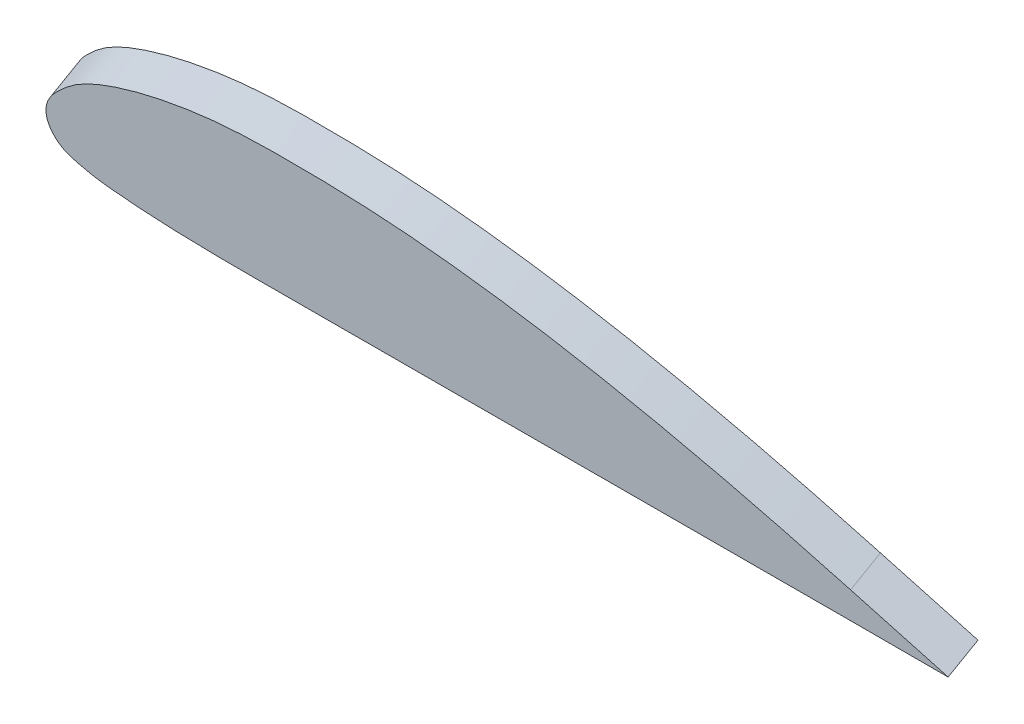
ISO-10303-21;
HEADER;
FILE_DESCRIPTION(('STEP AP214'),'2;1');
FILE_NAME('part.step','',(''),(''),'','','');
FILE_SCHEMA(('AUTOMOTIVE_DESIGN { 1 0 10303 214 1 1 1 1 }'));
ENDSEC;
DATA;
#1=APPLICATION_CONTEXT('core data for automotive mechanical design processes');
#2=APPLICATION_PROTOCOL_DEFINITION('international standard','automotive_design',2000,#1);
#3=PRODUCT_CONTEXT('',#1,'mechanical');
#4=PRODUCT('Part','Part','',(#3));
#5=PRODUCT_RELATED_PRODUCT_CATEGORY('part','',(#4));
#6=PRODUCT_DEFINITION_FORMATION('','',#4);
#7=PRODUCT_DEFINITION_CONTEXT('part definition',#1,'design');
#8=PRODUCT_DEFINITION('design','',#6,#7);
#9=PRODUCT_DEFINITION_SHAPE('','',#8);
#10=(LENGTH_UNIT() NAMED_UNIT(*) SI_UNIT(.MILLI.,.METRE.));
#11=(NAMED_UNIT(*) PLANE_ANGLE_UNIT() SI_UNIT($,.RADIAN.));
#12=(NAMED_UNIT(*) SI_UNIT($,.STERADIAN.) SOLID_ANGLE_UNIT());
#13=UNCERTAINTY_MEASURE_WITH_UNIT(LENGTH_MEASURE(1.E-05),#10,'distance_accuracy_value','');
#14=(GEOMETRIC_REPRESENTATION_CONTEXT(3) GLOBAL_UNCERTAINTY_ASSIGNED_CONTEXT((#13)) GLOBAL_UNIT_ASSIGNED_CONTEXT((#10,
#11,#12)) REPRESENTATION_CONTEXT('',''));
#15=CARTESIAN_POINT('',(0.,0.,0.));
#16=DIRECTION('',(0.,0.,1.));
#17=DIRECTION('',(1.,0.,0.));
#18=AXIS2_PLACEMENT_3D('',#15,#16,#17);
#19=CARTESIAN_POINT('',(354.90964458785,29.1294869729212,0.));
#20=DIRECTION('',(0.,0.,-1.));
#21=DIRECTION('',(-1.,0.,0.));
#22=AXIS2_PLACEMENT_3D('',#19,#20,#21);
#23=PLANE('',#22);
#24=CARTESIAN_POINT('',(439.94359402656,25.9631496413614,0.));
#25=CARTESIAN_POINT('',(436.482792760671,26.9124708064895,0.));
#26=CARTESIAN_POINT('',(429.550066215445,28.7613489740832,0.));
#27=CARTESIAN_POINT('',(419.041111506581,31.1758554931935,0.));
#28=CARTESIAN_POINT('',(408.453689189646,33.2394395205814,0.));
#29=CARTESIAN_POINT('',(399.52973881786,34.5106097507142,0.));
#30=CARTESIAN_POINT('',(392.35118296949,35.2135057166244,0.));
#31=CARTESIAN_POINT('',(386.932530948564,35.5372889132557,0.));
#32=CARTESIAN_POINT('',(381.527529235733,35.6454430236421,0.));
#33=CARTESIAN_POINT('',(377.015250499237,35.6302670471964,0.));
#34=CARTESIAN_POINT('',(373.366587290452,35.4390011650997,0.));
#35=CARTESIAN_POINT('',(370.623096690243,35.1625337106828,0.));
#36=CARTESIAN_POINT('',(367.9054313894,34.7503143662168,0.));
#37=CARTESIAN_POINT('',(365.202372020835,34.2104508503772,0.));
#38=CARTESIAN_POINT('',(362.962683698791,33.6160925230625,0.));
#39=CARTESIAN_POINT('',(361.199294651974,33.0534223098556,0.));
#40=CARTESIAN_POINT('',(359.868429842576,32.565910103589,0.));
#41=CARTESIAN_POINT('',(358.760294974668,32.0735088960086,0.));
#42=CARTESIAN_POINT('',(357.883845635144,31.6072103473162,0.));
#43=CARTESIAN_POINT('',(357.227141800147,31.2029644432148,0.));
#44=CARTESIAN_POINT('',(356.595624686167,30.7474639022175,0.));
#45=CARTESIAN_POINT('',(356.00596985145,30.2429545848123,0.));
#46=CARTESIAN_POINT('',(355.50065243675,29.7753525955777,0.));
#47=CARTESIAN_POINT('',(355.010956824966,29.28151976439,0.));
#48=CARTESIAN_POINT('',(354.609080991262,28.726654823746,0.));
#49=CARTESIAN_POINT('',(354.374139314419,28.2693218387925,0.));
#50=CARTESIAN_POINT('',(354.235157948098,27.7671003738955,0.));
#51=CARTESIAN_POINT('',(354.200717629491,27.3238852073149,0.));
#52=CARTESIAN_POINT('',(354.244072954479,26.9126728753785,0.));
#53=CARTESIAN_POINT('',(354.367021799495,26.5021360746915,0.));
#54=CARTESIAN_POINT('',(354.509437785875,26.2039959483968,0.));
#55=CARTESIAN_POINT('',(354.729497016152,25.8426556776621,0.));
#56=CARTESIAN_POINT('',(355.02987216726,25.4850936844051,0.));
#57=CARTESIAN_POINT('',(355.403771523246,25.1437416418182,0.));
#58=CARTESIAN_POINT('',(355.822308781184,24.8431213634903,0.));
#59=CARTESIAN_POINT('',(356.277249077005,24.6025801070023,0.));
#60=CARTESIAN_POINT('',(356.850755271098,24.3745811476468,0.));
#61=CARTESIAN_POINT('',(357.507783854837,24.2010199819797,0.));
#62=CARTESIAN_POINT('',(358.14442206978,24.0531436858631,0.));
#63=CARTESIAN_POINT('',(358.851382423202,23.8960371387714,0.));
#64=CARTESIAN_POINT('',(359.561595356398,23.7682644876989,0.));
#65=CARTESIAN_POINT('',(360.506762957293,23.6317291148706,0.));
#66=CARTESIAN_POINT('',(361.661444970574,23.514624116387,0.));
#67=CARTESIAN_POINT('',(363.003159237673,23.4001380489418,0.));
#68=CARTESIAN_POINT('',(364.817543155761,23.2635308373283,0.));
#69=CARTESIAN_POINT('',(367.076207923508,23.1439086800102,0.));
#70=CARTESIAN_POINT('',(369.783974515702,23.0555928038938,0.));
#71=CARTESIAN_POINT('',(372.484696578267,23.0107893002023,0.));
#72=CARTESIAN_POINT('',(375.179374968371,22.9944579898826,0.));
#73=CARTESIAN_POINT('',(377.869110837939,22.9963635575422,0.));
#74=CARTESIAN_POINT('',(381.446948809818,23.0094325868041,0.));
#75=CARTESIAN_POINT('',(385.914265581018,23.017662970252,0.));
#76=CARTESIAN_POINT('',(391.281573942475,23.0244246453286,0.));
#77=CARTESIAN_POINT('',(396.646882489041,23.035034190771,0.));
#78=CARTESIAN_POINT('',(402.012427725938,23.0447623803531,0.));
#79=CARTESIAN_POINT('',(409.166405956966,23.0580205745886,0.));
#80=CARTESIAN_POINT('',(418.108767199081,23.0736385256262,0.));
#81=CARTESIAN_POINT('',(428.83978305649,23.093255111195,0.));
#82=CARTESIAN_POINT('',(435.993988436485,23.1056428691844,0.));
#83=CARTESIAN_POINT('',(439.571065793784,23.1124523795362,0.));
#84=B_SPLINE_CURVE_WITH_KNOTS('',3,(#24,#25,#26,#27,#28,#29,#30,#31,#32,#33,#34,#35,#36,#37,#38,
#39,#40,#41,#42,#43,#44,#45,#46,#47,#48,#49,#50,#51,#52,#53,#54,#55,#56,#57,#58,#59,#60,#61,#62,
#63,#64,#65,#66,#67,#68,#69,#70,#71,#72,#73,#74,#75,#76,#77,#78,#79,#80,#81,#82,#83),
.UNSPECIFIED.,.F.,.F.,(4,1,1,1,1,1,1,1,1,1,1,1,1,1,1,1,1,1,1,1,1,1,1,1,1,1,1,1,1,1,1,1,1,1,1,1,
1,1,1,1,1,1,1,1,1,1,1,1,1,1,1,1,1,1,1,1,1,4),(0.,0.0624995149546497,0.124999029909299,
0.187498544863949,0.249998059818599,0.281247817295924,0.312497574773248,0.343747332250573,
0.374997089727898,0.390621968466561,0.406246847205223,0.421871725943886,0.437496604682548,
0.45312148342121,0.460933922790542,0.468746362159873,0.476558801529204,0.48046502121387,
0.484371240898535,0.488277460583201,0.492183680267866,0.496089899952532,0.499996119637198,
0.50194922947953,0.503902339321863,0.50487889424303,0.505855449164196,0.506832004085362,
0.507808559006529,0.508785113927695,0.509761668848862,0.511714778691194,0.513667888533527,
0.51562099837586,0.517574108218193,0.519527218060526,0.523433437745191,0.527339657429857,
0.531245877114522,0.535152096799188,0.539058316483854,0.546870755853185,0.554683195222516,
0.562495634591847,0.57812051333051,0.593745392069172,0.609370270807835,0.624995149546497,
0.640620028285159,0.656244907023822,0.687494664501147,0.718744421978472,0.749994179455796,
0.781243936933121,0.812493694410446,0.874993209365096,0.937492724319746,0.999992239274395),.UNSPECIFIED.);
#85=CARTESIAN_POINT('',(439.94359402656,25.9631496413614,0.));
#86=VERTEX_POINT('',#85);
#87=CARTESIAN_POINT('',(439.571065793784,23.1124523795362,0.));
#88=VERTEX_POINT('',#87);
#89=EDGE_CURVE('E63',#86,#88,#84,.T.);
#90=ORIENTED_EDGE('',*,*,#89,.F.);
#91=DIRECTION('',(-0.964376117229069,0.264534883367365,0.));
#92=VECTOR('',#91,1.);
#93=CARTESIAN_POINT('',(450.335963916533,23.1124523795362,0.));
#94=LINE('',#93,#92);
#95=CARTESIAN_POINT('',(450.335963916533,23.1124523795362,0.));
#96=VERTEX_POINT('',#95);
#97=EDGE_CURVE('E66',#96,#86,#94,.T.);
#98=ORIENTED_EDGE('',*,*,#97,.F.);
#99=DIRECTION('',(1.,0.,0.));
#100=VECTOR('',#99,1.);
#101=CARTESIAN_POINT('',(439.571065793784,23.1124523795362,0.));
#102=LINE('',#101,#100);
#103=EDGE_CURVE('E69',#88,#96,#102,.T.);
#104=ORIENTED_EDGE('',*,*,#103,.F.);
#105=EDGE_LOOP('',(#90,#98,#104));
#106=FACE_BOUND('',#105,.T.);
#107=ADVANCED_FACE('F33',(#106),#23,.T.);
#108=CARTESIAN_POINT('',(356.729495759181,29.1294869729212,5.));
#109=DIRECTION('',(0.,0.,-1.));
#110=DIRECTION('',(-1.,0.,0.));
#111=AXIS2_PLACEMENT_3D('',#108,#109,#110);
#112=PLANE('',#111);
#113=CARTESIAN_POINT('',(441.763445197891,25.9631496413614,5.));
#114=CARTESIAN_POINT('',(438.302643932002,26.9124708064895,5.));
#115=CARTESIAN_POINT('',(431.369917386776,28.7613489740832,5.));
#116=CARTESIAN_POINT('',(420.860962677912,31.1758554931935,5.));
#117=CARTESIAN_POINT('',(410.273540360977,33.2394395205814,5.));
#118=CARTESIAN_POINT('',(401.349589989191,34.5106097507142,5.));
#119=CARTESIAN_POINT('',(394.171034140821,35.2135057166244,5.));
#120=CARTESIAN_POINT('',(388.752382119895,35.5372889132557,5.));
#121=CARTESIAN_POINT('',(383.347380407064,35.6454430236421,5.));
#122=CARTESIAN_POINT('',(378.835101670568,35.6302670471964,5.));
#123=CARTESIAN_POINT('',(375.186438461783,35.4390011650997,5.));
#124=CARTESIAN_POINT('',(372.442947861574,35.1625337106828,5.));
#125=CARTESIAN_POINT('',(369.725282560731,34.7503143662168,5.));
#126=CARTESIAN_POINT('',(367.022223192166,34.2104508503772,5.));
#127=CARTESIAN_POINT('',(364.782534870122,33.6160925230625,5.));
#128=CARTESIAN_POINT('',(363.019145823305,33.0534223098556,5.));
#129=CARTESIAN_POINT('',(361.688281013907,32.565910103589,5.));
#130=CARTESIAN_POINT('',(360.580146145999,32.0735088960086,5.));
#131=CARTESIAN_POINT('',(359.703696806475,31.6072103473162,5.));
#132=CARTESIAN_POINT('',(359.046992971478,31.2029644432148,5.));
#133=CARTESIAN_POINT('',(358.415475857498,30.7474639022175,5.));
#134=CARTESIAN_POINT('',(357.825821022781,30.2429545848123,5.));
#135=CARTESIAN_POINT('',(357.320503608081,29.7753525955777,5.));
#136=CARTESIAN_POINT('',(356.830807996297,29.28151976439,5.));
#137=CARTESIAN_POINT('',(356.428932162593,28.726654823746,5.));
#138=CARTESIAN_POINT('',(356.19399048575,28.2693218387925,5.));
#139=CARTESIAN_POINT('',(356.055009119429,27.7671003738955,5.));
#140=CARTESIAN_POINT('',(356.020568800822,27.3238852073149,5.));
#141=CARTESIAN_POINT('',(356.06392412581,26.9126728753785,5.));
#142=CARTESIAN_POINT('',(356.186872970826,26.5021360746915,5.));
#143=CARTESIAN_POINT('',(356.329288957206,26.2039959483968,5.));
#144=CARTESIAN_POINT('',(356.549348187483,25.8426556776621,5.));
#145=CARTESIAN_POINT('',(356.849723338591,25.4850936844051,5.));
#146=CARTESIAN_POINT('',(357.223622694577,25.1437416418182,5.));
#147=CARTESIAN_POINT('',(357.642159952515,24.8431213634903,5.));
#148=CARTESIAN_POINT('',(358.097100248336,24.6025801070023,5.));
#149=CARTESIAN_POINT('',(358.670606442429,24.3745811476468,5.));
#150=CARTESIAN_POINT('',(359.327635026168,24.2010199819797,5.));
#151=CARTESIAN_POINT('',(359.964273241111,24.0531436858631,5.));
#152=CARTESIAN_POINT('',(360.671233594533,23.8960371387714,5.));
#153=CARTESIAN_POINT('',(361.381446527729,23.7682644876989,5.));
#154=CARTESIAN_POINT('',(362.326614128624,23.6317291148706,5.));
#155=CARTESIAN_POINT('',(363.481296141905,23.514624116387,5.));
#156=CARTESIAN_POINT('',(364.823010409004,23.4001380489418,5.));
#157=CARTESIAN_POINT('',(366.637394327092,23.2635308373283,5.));
#158=CARTESIAN_POINT('',(368.896059094839,23.1439086800102,5.));
#159=CARTESIAN_POINT('',(371.603825687033,23.0555928038938,5.));
#160=CARTESIAN_POINT('',(374.304547749598,23.0107893002023,5.));
#161=CARTESIAN_POINT('',(376.999226139702,22.9944579898826,5.));
#162=CARTESIAN_POINT('',(379.68896200927,22.9963635575422,5.));
#163=CARTESIAN_POINT('',(383.266799981149,23.0094325868041,5.));
#164=CARTESIAN_POINT('',(387.734116752349,23.017662970252,5.));
#165=CARTESIAN_POINT('',(393.101425113806,23.0244246453286,5.));
#166=CARTESIAN_POINT('',(398.466733660372,23.035034190771,5.));
#167=CARTESIAN_POINT('',(403.832278897269,23.0447623803531,5.));
#168=CARTESIAN_POINT('',(410.986257128297,23.0580205745886,5.));
#169=CARTESIAN_POINT('',(419.928618370412,23.0736385256262,5.));
#170=CARTESIAN_POINT('',(430.659634227821,23.093255111195,5.));
#171=CARTESIAN_POINT('',(437.813839607816,23.1056428691844,5.));
#172=CARTESIAN_POINT('',(441.390916965115,23.1124523795362,5.));
#173=B_SPLINE_CURVE_WITH_KNOTS('',3,(#113,#114,#115,#116,#117,#118,#119,#120,#121,#122,#123,
#124,#125,#126,#127,#128,#129,#130,#131,#132,#133,#134,#135,#136,#137,#138,#139,#140,#141,#142,
#143,#144,#145,#146,#147,#148,#149,#150,#151,#152,#153,#154,#155,#156,#157,#158,#159,#160,#161,
#162,#163,#164,#165,#166,#167,#168,#169,#170,#171,#172),.UNSPECIFIED.,.F.,.F.,(4,1,1,1,1,1,1,1,
1,1,1,1,1,1,1,1,1,1,1,1,1,1,1,1,1,1,1,1,1,1,1,1,1,1,1,1,1,1,1,1,1,1,1,1,1,1,1,1,1,1,1,1,1,1,1,1,
1,4),(0.,0.0624995149546497,0.124999029909299,0.187498544863949,0.249998059818599,
0.281247817295924,0.312497574773248,0.343747332250573,0.374997089727898,0.390621968466561,
0.406246847205223,0.421871725943886,0.437496604682548,0.45312148342121,0.460933922790542,
0.468746362159873,0.476558801529204,0.48046502121387,0.484371240898535,0.488277460583201,
0.492183680267866,0.496089899952532,0.499996119637198,0.50194922947953,0.503902339321863,
0.50487889424303,0.505855449164196,0.506832004085362,0.507808559006529,0.508785113927695,
0.509761668848862,0.511714778691194,0.513667888533527,0.51562099837586,0.517574108218193,
0.519527218060526,0.523433437745191,0.527339657429857,0.531245877114522,0.535152096799188,
0.539058316483854,0.546870755853185,0.554683195222516,0.562495634591847,0.57812051333051,
0.593745392069172,0.609370270807835,0.624995149546497,0.640620028285159,0.656244907023822,
0.687494664501147,0.718744421978472,0.749994179455796,0.781243936933121,0.812493694410446,
0.874993209365096,0.937492724319746,0.999992239274395),.UNSPECIFIED.);
#174=CARTESIAN_POINT('',(441.763445197891,25.9631496413614,5.00000000000001));
#175=VERTEX_POINT('',#174);
#176=CARTESIAN_POINT('',(441.390916965115,23.1124523795362,5.00000000000001));
#177=VERTEX_POINT('',#176);
#178=EDGE_CURVE('E11',#175,#177,#173,.T.);
#179=ORIENTED_EDGE('',*,*,#178,.T.);
#180=DIRECTION('',(1.,0.,0.));
#181=VECTOR('',#180,1.);
#182=CARTESIAN_POINT('',(441.390916965115,23.1124523795362,5.));
#183=LINE('',#182,#181);
#184=CARTESIAN_POINT('',(452.155815087864,23.1124523795362,5.00000000000001));
#185=VERTEX_POINT('',#184);
#186=EDGE_CURVE('E53',#177,#185,#183,.T.);
#187=ORIENTED_EDGE('',*,*,#186,.T.);
#188=DIRECTION('',(-0.964376117229069,0.264534883367365,0.));
#189=VECTOR('',#188,1.);
#190=CARTESIAN_POINT('',(452.155815087864,23.1124523795362,5.));
#191=LINE('',#190,#189);
#192=EDGE_CURVE('E48',#185,#175,#191,.T.);
#193=ORIENTED_EDGE('',*,*,#192,.T.);
#194=EDGE_LOOP('',(#179,#187,#193));
#195=FACE_BOUND('',#194,.T.);
#196=ADVANCED_FACE('F103',(#195),#112,.F.);
#197=CARTESIAN_POINT('',(439.571065793784,23.1124523795362,0.));
#198=DIRECTION('',(0.,-1.,0.));
#199=DIRECTION('',(0.,0.,-1.));
#200=AXIS2_PLACEMENT_3D('',#197,#198,#199);
#201=PLANE('',#200);
#202=DIRECTION('',(0.342020143325665,0.,0.93969262078591));
#203=VECTOR('',#202,1.);
#204=CARTESIAN_POINT('',(450.335963916533,23.1124523795362,0.));
#205=LINE('',#204,#203);
#206=EDGE_CURVE('E83',#96,#185,#205,.T.);
#207=ORIENTED_EDGE('',*,*,#206,.T.);
#208=ORIENTED_EDGE('',*,*,#186,.F.);
#209=DIRECTION('',(0.342020143325665,0.,0.93969262078591));
#210=VECTOR('',#209,1.);
#211=CARTESIAN_POINT('',(439.571065793784,23.1124523795362,0.));
#212=LINE('',#211,#210);
#213=EDGE_CURVE('E79',#88,#177,#212,.T.);
#214=ORIENTED_EDGE('',*,*,#213,.F.);
#215=ORIENTED_EDGE('',*,*,#103,.T.);
#216=EDGE_LOOP('',(#207,#208,#214,#215));
#217=FACE_BOUND('',#216,.T.);
#218=ADVANCED_FACE('F81',(#217),#201,.T.);
#219=CARTESIAN_POINT('',(450.335963916533,23.1124523795362,0.));
#220=DIRECTION('',(0.263317173609733,0.959936890942431,-0.0958396133650473));
#221=DIRECTION('',(-0.964376117229069,0.264534883367365,0.));
#222=AXIS2_PLACEMENT_3D('',#219,#220,#221);
#223=PLANE('',#222);
#224=DIRECTION('',(0.342020143325665,0.,0.93969262078591));
#225=VECTOR('',#224,1.);
#226=CARTESIAN_POINT('',(439.94359402656,25.9631496413614,0.));
#227=LINE('',#226,#225);
#228=EDGE_CURVE('E42',#86,#175,#227,.T.);
#229=ORIENTED_EDGE('',*,*,#228,.T.);
#230=ORIENTED_EDGE('',*,*,#192,.F.);
#231=ORIENTED_EDGE('',*,*,#206,.F.);
#232=ORIENTED_EDGE('',*,*,#97,.T.);
#233=EDGE_LOOP('',(#229,#230,#231,#232));
#234=FACE_BOUND('',#233,.T.);
#235=ADVANCED_FACE('F95',(#234),#223,.T.);
#236=CARTESIAN_POINT('',(439.94359402656,25.9631496413614,0.));
#237=CARTESIAN_POINT('',(441.763445197891,25.9631496413614,5.));
#238=CARTESIAN_POINT('',(436.482792760671,26.9124708064895,0.));
#239=CARTESIAN_POINT('',(438.302643932002,26.9124708064895,5.));
#240=CARTESIAN_POINT('',(429.550066215445,28.7613489740832,0.));
#241=CARTESIAN_POINT('',(431.369917386776,28.7613489740832,5.));
#242=CARTESIAN_POINT('',(419.041111506581,31.1758554931935,0.));
#243=CARTESIAN_POINT('',(420.860962677912,31.1758554931935,5.));
#244=CARTESIAN_POINT('',(408.453689189646,33.2394395205814,0.));
#245=CARTESIAN_POINT('',(410.273540360977,33.2394395205814,5.));
#246=CARTESIAN_POINT('',(399.52973881786,34.5106097507142,0.));
#247=CARTESIAN_POINT('',(401.349589989191,34.5106097507142,5.));
#248=CARTESIAN_POINT('',(392.35118296949,35.2135057166244,0.));
#249=CARTESIAN_POINT('',(394.171034140821,35.2135057166244,5.));
#250=CARTESIAN_POINT('',(386.932530948564,35.5372889132557,0.));
#251=CARTESIAN_POINT('',(388.752382119895,35.5372889132557,5.));
#252=CARTESIAN_POINT('',(381.527529235733,35.6454430236421,0.));
#253=CARTESIAN_POINT('',(383.347380407064,35.6454430236421,5.));
#254=CARTESIAN_POINT('',(377.015250499237,35.6302670471964,0.));
#255=CARTESIAN_POINT('',(378.835101670568,35.6302670471964,5.));
#256=CARTESIAN_POINT('',(373.366587290452,35.4390011650997,0.));
#257=CARTESIAN_POINT('',(375.186438461783,35.4390011650997,5.));
#258=CARTESIAN_POINT('',(370.623096690243,35.1625337106828,0.));
#259=CARTESIAN_POINT('',(372.442947861574,35.1625337106828,5.));
#260=CARTESIAN_POINT('',(367.9054313894,34.7503143662168,0.));
#261=CARTESIAN_POINT('',(369.725282560731,34.7503143662168,5.));
#262=CARTESIAN_POINT('',(365.202372020835,34.2104508503772,0.));
#263=CARTESIAN_POINT('',(367.022223192166,34.2104508503772,5.));
#264=CARTESIAN_POINT('',(362.962683698791,33.6160925230625,0.));
#265=CARTESIAN_POINT('',(364.782534870122,33.6160925230625,5.));
#266=CARTESIAN_POINT('',(361.199294651974,33.0534223098556,0.));
#267=CARTESIAN_POINT('',(363.019145823305,33.0534223098556,5.));
#268=CARTESIAN_POINT('',(359.868429842576,32.565910103589,0.));
#269=CARTESIAN_POINT('',(361.688281013907,32.565910103589,5.));
#270=CARTESIAN_POINT('',(358.760294974668,32.0735088960086,0.));
#271=CARTESIAN_POINT('',(360.580146145999,32.0735088960086,5.));
#272=CARTESIAN_POINT('',(357.883845635144,31.6072103473162,0.));
#273=CARTESIAN_POINT('',(359.703696806475,31.6072103473162,5.));
#274=CARTESIAN_POINT('',(357.227141800147,31.2029644432148,0.));
#275=CARTESIAN_POINT('',(359.046992971478,31.2029644432148,5.));
#276=CARTESIAN_POINT('',(356.595624686167,30.7474639022175,0.));
#277=CARTESIAN_POINT('',(358.415475857498,30.7474639022175,5.));
#278=CARTESIAN_POINT('',(356.00596985145,30.2429545848123,0.));
#279=CARTESIAN_POINT('',(357.825821022781,30.2429545848123,5.));
#280=CARTESIAN_POINT('',(355.50065243675,29.7753525955777,0.));
#281=CARTESIAN_POINT('',(357.320503608081,29.7753525955777,5.));
#282=CARTESIAN_POINT('',(355.010956824966,29.28151976439,0.));
#283=CARTESIAN_POINT('',(356.830807996297,29.28151976439,5.));
#284=CARTESIAN_POINT('',(354.609080991262,28.726654823746,0.));
#285=CARTESIAN_POINT('',(356.428932162593,28.726654823746,5.));
#286=CARTESIAN_POINT('',(354.374139314419,28.2693218387925,0.));
#287=CARTESIAN_POINT('',(356.19399048575,28.2693218387925,5.));
#288=CARTESIAN_POINT('',(354.235157948098,27.7671003738955,0.));
#289=CARTESIAN_POINT('',(356.055009119429,27.7671003738955,5.));
#290=CARTESIAN_POINT('',(354.200717629491,27.3238852073149,0.));
#291=CARTESIAN_POINT('',(356.020568800822,27.3238852073149,5.));
#292=CARTESIAN_POINT('',(354.244072954479,26.9126728753785,0.));
#293=CARTESIAN_POINT('',(356.06392412581,26.9126728753785,5.));
#294=CARTESIAN_POINT('',(354.367021799495,26.5021360746915,0.));
#295=CARTESIAN_POINT('',(356.186872970826,26.5021360746915,5.));
#296=CARTESIAN_POINT('',(354.509437785875,26.2039959483968,0.));
#297=CARTESIAN_POINT('',(356.329288957206,26.2039959483968,5.));
#298=CARTESIAN_POINT('',(354.729497016152,25.8426556776621,0.));
#299=CARTESIAN_POINT('',(356.549348187483,25.8426556776621,5.));
#300=CARTESIAN_POINT('',(355.02987216726,25.4850936844051,0.));
#301=CARTESIAN_POINT('',(356.849723338591,25.4850936844051,5.));
#302=CARTESIAN_POINT('',(355.403771523246,25.1437416418182,0.));
#303=CARTESIAN_POINT('',(357.223622694577,25.1437416418182,5.));
#304=CARTESIAN_POINT('',(355.822308781184,24.8431213634903,0.));
#305=CARTESIAN_POINT('',(357.642159952515,24.8431213634903,5.));
#306=CARTESIAN_POINT('',(356.277249077005,24.6025801070023,0.));
#307=CARTESIAN_POINT('',(358.097100248336,24.6025801070023,5.));
#308=CARTESIAN_POINT('',(356.850755271098,24.3745811476468,0.));
#309=CARTESIAN_POINT('',(358.670606442429,24.3745811476468,5.));
#310=CARTESIAN_POINT('',(357.507783854837,24.2010199819797,0.));
#311=CARTESIAN_POINT('',(359.327635026168,24.2010199819797,5.));
#312=CARTESIAN_POINT('',(358.14442206978,24.0531436858631,0.));
#313=CARTESIAN_POINT('',(359.964273241111,24.0531436858631,5.));
#314=CARTESIAN_POINT('',(358.851382423202,23.8960371387714,0.));
#315=CARTESIAN_POINT('',(360.671233594533,23.8960371387714,5.));
#316=CARTESIAN_POINT('',(359.561595356398,23.7682644876989,0.));
#317=CARTESIAN_POINT('',(361.381446527729,23.7682644876989,5.));
#318=CARTESIAN_POINT('',(360.506762957293,23.6317291148706,0.));
#319=CARTESIAN_POINT('',(362.326614128624,23.6317291148706,5.));
#320=CARTESIAN_POINT('',(361.661444970574,23.514624116387,0.));
#321=CARTESIAN_POINT('',(363.481296141905,23.514624116387,5.));
#322=CARTESIAN_POINT('',(363.003159237673,23.4001380489418,0.));
#323=CARTESIAN_POINT('',(364.823010409004,23.4001380489418,5.));
#324=CARTESIAN_POINT('',(364.817543155761,23.2635308373283,0.));
#325=CARTESIAN_POINT('',(366.637394327092,23.2635308373283,5.));
#326=CARTESIAN_POINT('',(367.076207923508,23.1439086800102,0.));
#327=CARTESIAN_POINT('',(368.896059094839,23.1439086800102,5.));
#328=CARTESIAN_POINT('',(369.783974515702,23.0555928038938,0.));
#329=CARTESIAN_POINT('',(371.603825687033,23.0555928038938,5.));
#330=CARTESIAN_POINT('',(372.484696578267,23.0107893002023,0.));
#331=CARTESIAN_POINT('',(374.304547749598,23.0107893002023,5.));
#332=CARTESIAN_POINT('',(375.179374968371,22.9944579898826,0.));
#333=CARTESIAN_POINT('',(376.999226139702,22.9944579898826,5.));
#334=CARTESIAN_POINT('',(377.869110837939,22.9963635575422,0.));
#335=CARTESIAN_POINT('',(379.68896200927,22.9963635575422,5.));
#336=CARTESIAN_POINT('',(381.446948809818,23.0094325868041,0.));
#337=CARTESIAN_POINT('',(383.266799981149,23.0094325868041,5.));
#338=CARTESIAN_POINT('',(385.914265581018,23.017662970252,0.));
#339=CARTESIAN_POINT('',(387.734116752349,23.017662970252,5.));
#340=CARTESIAN_POINT('',(391.281573942475,23.0244246453286,0.));
#341=CARTESIAN_POINT('',(393.101425113806,23.0244246453286,5.));
#342=CARTESIAN_POINT('',(396.646882489041,23.035034190771,0.));
#343=CARTESIAN_POINT('',(398.466733660372,23.035034190771,5.));
#344=CARTESIAN_POINT('',(402.012427725938,23.0447623803531,0.));
#345=CARTESIAN_POINT('',(403.832278897269,23.0447623803531,5.));
#346=CARTESIAN_POINT('',(409.166405956966,23.0580205745886,0.));
#347=CARTESIAN_POINT('',(410.986257128297,23.0580205745886,5.));
#348=CARTESIAN_POINT('',(418.108767199081,23.0736385256262,0.));
#349=CARTESIAN_POINT('',(419.928618370412,23.0736385256262,5.));
#350=CARTESIAN_POINT('',(428.83978305649,23.093255111195,0.));
#351=CARTESIAN_POINT('',(430.659634227821,23.093255111195,5.));
#352=CARTESIAN_POINT('',(435.993988436485,23.1056428691844,0.));
#353=CARTESIAN_POINT('',(437.813839607816,23.1056428691844,5.));
#354=CARTESIAN_POINT('',(439.571065793784,23.1124523795362,0.));
#355=CARTESIAN_POINT('',(441.390916965115,23.1124523795362,5.));
#356=B_SPLINE_SURFACE_WITH_KNOTS('',3,1,((#236,#237),(#238,#239),(#240,#241),(#242,#243),(#244,
#245),(#246,#247),(#248,#249),(#250,#251),(#252,#253),(#254,#255),(#256,#257),(#258,#259),(#260,
#261),(#262,#263),(#264,#265),(#266,#267),(#268,#269),(#270,#271),(#272,#273),(#274,#275),(#276,
#277),(#278,#279),(#280,#281),(#282,#283),(#284,#285),(#286,#287),(#288,#289),(#290,#291),(#292,
#293),(#294,#295),(#296,#297),(#298,#299),(#300,#301),(#302,#303),(#304,#305),(#306,#307),(#308,
#309),(#310,#311),(#312,#313),(#314,#315),(#316,#317),(#318,#319),(#320,#321),(#322,#323),(#324,
#325),(#326,#327),(#328,#329),(#330,#331),(#332,#333),(#334,#335),(#336,#337),(#338,#339),(#340,
#341),(#342,#343),(#344,#345),(#346,#347),(#348,#349),(#350,#351),(#352,#353),(#354,#355)),
.UNSPECIFIED.,.F.,.F.,.F.,(4,1,1,1,1,1,1,1,1,1,1,1,1,1,1,1,1,1,1,1,1,1,1,1,1,1,1,1,1,1,1,1,1,1,
1,1,1,1,1,1,1,1,1,1,1,1,1,1,1,1,1,1,1,1,1,1,1,4),(2,2),(0.,0.0625,0.125,0.1875,0.25,0.28125,
0.3125,0.34375,0.375,0.390625,0.40625,0.421875,0.4375,0.453125,0.4609375,0.46875,0.4765625,
0.48046875,0.484375,0.48828125,0.4921875,0.49609375,0.5,0.501953125,0.50390625,0.5048828125,
0.505859375,0.5068359375,0.5078125,0.5087890625,0.509765625,0.51171875,0.513671875,0.515625,
0.517578125,0.51953125,0.5234375,0.52734375,0.53125,0.53515625,0.5390625,0.546875,0.5546875,
0.5625,0.578125,0.59375,0.609375,0.625,0.640625,0.65625,0.6875,0.71875,0.75,0.78125,0.8125,
0.875,0.9375,1.),(0.,1.),.UNSPECIFIED.);
#357=ORIENTED_EDGE('',*,*,#178,.F.);
#358=ORIENTED_EDGE('',*,*,#228,.F.);
#359=ORIENTED_EDGE('',*,*,#89,.T.);
#360=ORIENTED_EDGE('',*,*,#213,.T.);
#361=EDGE_LOOP('',(#357,#358,#359,#360));
#362=FACE_BOUND('',#361,.T.);
#363=ADVANCED_FACE('F78',(#362),#356,.T.);
#364=CLOSED_SHELL('',(#107,#196,#218,#235,#363));
#365=MANIFOLD_SOLID_BREP('B2',#364);
#366=ADVANCED_BREP_SHAPE_REPRESENTATION('',(#18,#365),#14);
#367=SHAPE_DEFINITION_REPRESENTATION(#9,#366);
ENDSEC;
END-ISO-10303-21;
